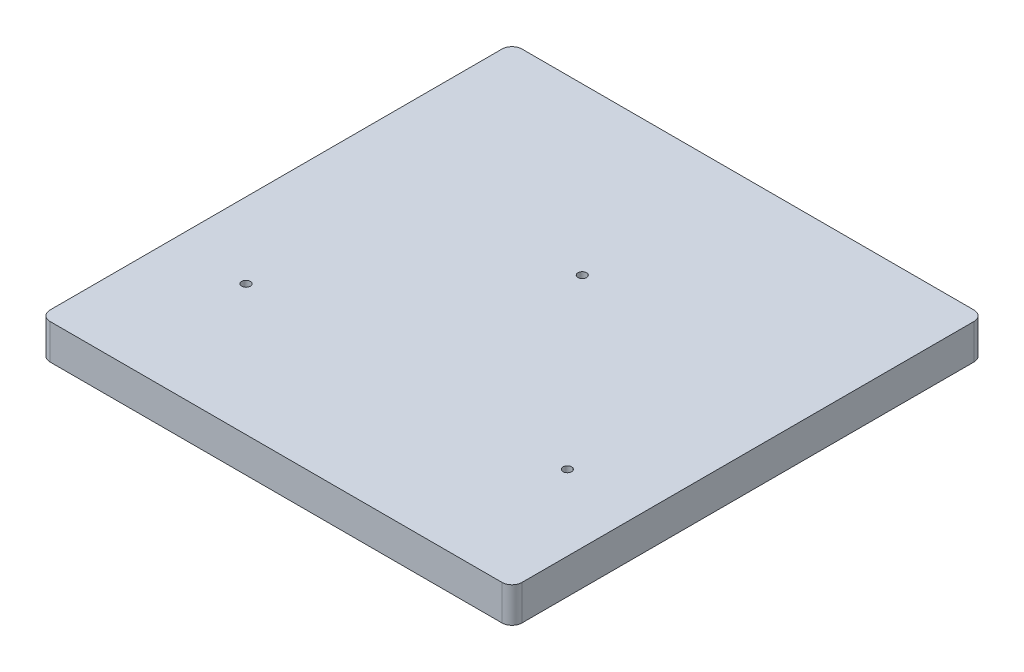
ISO-10303-21;
HEADER;
FILE_DESCRIPTION(('STEP AP214'),'2;1');
FILE_NAME('part.step','',(''),(''),'','','');
FILE_SCHEMA(('AUTOMOTIVE_DESIGN { 1 0 10303 214 1 1 1 1 }'));
ENDSEC;
DATA;
#1=APPLICATION_CONTEXT('core data for automotive mechanical design processes');
#2=APPLICATION_PROTOCOL_DEFINITION('international standard','automotive_design',2000,#1);
#3=PRODUCT_CONTEXT('',#1,'mechanical');
#4=PRODUCT('Part','Part','',(#3));
#5=PRODUCT_RELATED_PRODUCT_CATEGORY('part','',(#4));
#6=PRODUCT_DEFINITION_FORMATION('','',#4);
#7=PRODUCT_DEFINITION_CONTEXT('part definition',#1,'design');
#8=PRODUCT_DEFINITION('design','',#6,#7);
#9=PRODUCT_DEFINITION_SHAPE('','',#8);
#10=(LENGTH_UNIT() NAMED_UNIT(*) SI_UNIT(.MILLI.,.METRE.));
#11=(NAMED_UNIT(*) PLANE_ANGLE_UNIT() SI_UNIT($,.RADIAN.));
#12=(NAMED_UNIT(*) SI_UNIT($,.STERADIAN.) SOLID_ANGLE_UNIT());
#13=UNCERTAINTY_MEASURE_WITH_UNIT(LENGTH_MEASURE(1.E-05),#10,'distance_accuracy_value','');
#14=(GEOMETRIC_REPRESENTATION_CONTEXT(3) GLOBAL_UNCERTAINTY_ASSIGNED_CONTEXT((#13)) GLOBAL_UNIT_ASSIGNED_CONTEXT((#10,
#11,#12)) REPRESENTATION_CONTEXT('',''));
#15=CARTESIAN_POINT('',(0.,0.,0.));
#16=DIRECTION('',(0.,0.,1.));
#17=DIRECTION('',(1.,0.,0.));
#18=AXIS2_PLACEMENT_3D('',#15,#16,#17);
#19=CARTESIAN_POINT('',(76.2,-5.55625,76.2));
#20=DIRECTION('',(0.,1.,0.));
#21=DIRECTION('',(0.,0.,1.));
#22=AXIS2_PLACEMENT_3D('',#19,#20,#21);
#23=PLANE('',#22);
#24=CARTESIAN_POINT('',(-50.8000000000001,-5.55625,33.3077694401946));
#25=DIRECTION('',(0.,1.,0.));
#26=DIRECTION('',(0.,0.,1.));
#27=AXIS2_PLACEMENT_3D('',#24,#25,#26);
#28=CIRCLE('',#27,1.35254999999999);
#29=CARTESIAN_POINT('',(-50.8000000000001,-5.55625,34.6603194401946));
#30=VERTEX_POINT('',#29);
#31=EDGE_CURVE('E12',#30,#30,#28,.T.);
#32=ORIENTED_EDGE('',*,*,#31,.T.);
#33=EDGE_LOOP('',(#32));
#34=FACE_BOUND('',#33,.T.);
#35=CARTESIAN_POINT('',(50.8,-5.55625,33.3077694401947));
#36=DIRECTION('',(0.,1.,0.));
#37=DIRECTION('',(0.,0.,1.));
#38=AXIS2_PLACEMENT_3D('',#35,#36,#37);
#39=CIRCLE('',#38,1.35254999999999);
#40=CARTESIAN_POINT('',(50.8,-5.55625,34.6603194401947));
#41=VERTEX_POINT('',#40);
#42=EDGE_CURVE('E217',#41,#41,#39,.T.);
#43=ORIENTED_EDGE('',*,*,#42,.T.);
#44=EDGE_LOOP('',(#43));
#45=FACE_BOUND('',#44,.T.);
#46=CARTESIAN_POINT('',(0.,-5.55625,-22.2235425877767));
#47=DIRECTION('',(0.,1.,0.));
#48=DIRECTION('',(0.,0.,1.));
#49=AXIS2_PLACEMENT_3D('',#46,#47,#48);
#50=CIRCLE('',#49,1.35255);
#51=CARTESIAN_POINT('',(0.,-5.55625,-20.8709925877767));
#52=VERTEX_POINT('',#51);
#53=EDGE_CURVE('E209',#52,#52,#50,.T.);
#54=ORIENTED_EDGE('',*,*,#53,.T.);
#55=EDGE_LOOP('',(#54));
#56=FACE_BOUND('',#55,.T.);
#57=CARTESIAN_POINT('',(-71.4374999999998,-5.55625,71.4375));
#58=DIRECTION('',(0.,1.,0.));
#59=DIRECTION('',(0.,0.,-1.));
#60=AXIS2_PLACEMENT_3D('',#57,#58,#59);
#61=CIRCLE('',#60,3.175);
#62=CARTESIAN_POINT('',(-74.6124999999998,-5.55625,71.4375));
#63=VERTEX_POINT('',#62);
#64=CARTESIAN_POINT('',(-71.4374999999998,-5.55625,74.6125));
#65=VERTEX_POINT('',#64);
#66=EDGE_CURVE('E66',#63,#65,#61,.T.);
#67=ORIENTED_EDGE('',*,*,#66,.F.);
#68=DIRECTION('',(0.,0.,1.));
#69=VECTOR('',#68,1.);
#70=CARTESIAN_POINT('',(-74.6124999999998,-5.55625,71.4375));
#71=LINE('',#70,#69);
#72=CARTESIAN_POINT('',(-74.6124999999998,-5.55625,-71.4375));
#73=VERTEX_POINT('',#72);
#74=EDGE_CURVE('E154',#73,#63,#71,.T.);
#75=ORIENTED_EDGE('',*,*,#74,.F.);
#76=CARTESIAN_POINT('',(-71.4374999999998,-5.55625,-71.4375));
#77=DIRECTION('',(0.,1.,0.));
#78=DIRECTION('',(0.,0.,-1.));
#79=AXIS2_PLACEMENT_3D('',#76,#77,#78);
#80=CIRCLE('',#79,3.175);
#81=CARTESIAN_POINT('',(-71.4374999999998,-5.55625,-74.6125));
#82=VERTEX_POINT('',#81);
#83=EDGE_CURVE('E150',#82,#73,#80,.T.);
#84=ORIENTED_EDGE('',*,*,#83,.F.);
#85=DIRECTION('',(-1.,0.,0.));
#86=VECTOR('',#85,1.);
#87=CARTESIAN_POINT('',(-71.4374999999998,-5.55625,-74.6125));
#88=LINE('',#87,#86);
#89=CARTESIAN_POINT('',(71.4374999999998,-5.55625,-74.6125));
#90=VERTEX_POINT('',#89);
#91=EDGE_CURVE('E143',#90,#82,#88,.T.);
#92=ORIENTED_EDGE('',*,*,#91,.F.);
#93=CARTESIAN_POINT('',(71.4374999999998,-5.55625,-71.4375));
#94=DIRECTION('',(0.,1.,0.));
#95=DIRECTION('',(0.,0.,-1.));
#96=AXIS2_PLACEMENT_3D('',#93,#94,#95);
#97=CIRCLE('',#96,3.175);
#98=CARTESIAN_POINT('',(74.6124999999998,-5.55625,-71.4375));
#99=VERTEX_POINT('',#98);
#100=EDGE_CURVE('E139',#99,#90,#97,.T.);
#101=ORIENTED_EDGE('',*,*,#100,.F.);
#102=DIRECTION('',(0.,0.,-1.));
#103=VECTOR('',#102,1.);
#104=CARTESIAN_POINT('',(74.6124999999998,-5.55625,71.4375));
#105=LINE('',#104,#103);
#106=CARTESIAN_POINT('',(74.6124999999998,-5.55625,71.4375));
#107=VERTEX_POINT('',#106);
#108=EDGE_CURVE('E120',#107,#99,#105,.T.);
#109=ORIENTED_EDGE('',*,*,#108,.F.);
#110=CARTESIAN_POINT('',(71.4374999999998,-5.55625,71.4375));
#111=DIRECTION('',(0.,1.,0.));
#112=DIRECTION('',(0.,0.,1.));
#113=AXIS2_PLACEMENT_3D('',#110,#111,#112);
#114=CIRCLE('',#113,3.175);
#115=CARTESIAN_POINT('',(71.4374999999998,-5.55625,74.6125));
#116=VERTEX_POINT('',#115);
#117=EDGE_CURVE('E129',#116,#107,#114,.T.);
#118=ORIENTED_EDGE('',*,*,#117,.F.);
#119=DIRECTION('',(1.,0.,0.));
#120=VECTOR('',#119,1.);
#121=CARTESIAN_POINT('',(-71.4374999999998,-5.55625,74.6125));
#122=LINE('',#121,#120);
#123=EDGE_CURVE('E135',#65,#116,#122,.T.);
#124=ORIENTED_EDGE('',*,*,#123,.F.);
#125=EDGE_LOOP('',(#67,#75,#84,#92,#101,#109,#118,#124));
#126=FACE_BOUND('',#125,.T.);
#127=ADVANCED_FACE('F51',(#34,#45,#56,#126),#23,.F.);
#128=CARTESIAN_POINT('',(-76.2,5.55625,76.2));
#129=DIRECTION('',(0.,-1.,0.));
#130=DIRECTION('',(0.,0.,-1.));
#131=AXIS2_PLACEMENT_3D('',#128,#129,#130);
#132=PLANE('',#131);
#133=CARTESIAN_POINT('',(-50.8000000000001,5.55625,33.3077694401946));
#134=DIRECTION('',(0.,1.,0.));
#135=DIRECTION('',(0.,0.,1.));
#136=AXIS2_PLACEMENT_3D('',#133,#134,#135);
#137=CIRCLE('',#136,1.35255);
#138=CARTESIAN_POINT('',(-50.8000000000001,5.55625,34.6603194401946));
#139=VERTEX_POINT('',#138);
#140=EDGE_CURVE('E59',#139,#139,#137,.T.);
#141=ORIENTED_EDGE('',*,*,#140,.F.);
#142=EDGE_LOOP('',(#141));
#143=FACE_BOUND('',#142,.T.);
#144=CARTESIAN_POINT('',(50.8,5.55625,33.3077694401947));
#145=DIRECTION('',(0.,1.,0.));
#146=DIRECTION('',(0.,0.,1.));
#147=AXIS2_PLACEMENT_3D('',#144,#145,#146);
#148=CIRCLE('',#147,1.35255);
#149=CARTESIAN_POINT('',(50.8,5.55625,34.6603194401947));
#150=VERTEX_POINT('',#149);
#151=EDGE_CURVE('E213',#150,#150,#148,.T.);
#152=ORIENTED_EDGE('',*,*,#151,.F.);
#153=EDGE_LOOP('',(#152));
#154=FACE_BOUND('',#153,.T.);
#155=CARTESIAN_POINT('',(0.,5.55625,-22.2235425877767));
#156=DIRECTION('',(0.,1.,0.));
#157=DIRECTION('',(0.,0.,1.));
#158=AXIS2_PLACEMENT_3D('',#155,#156,#157);
#159=CIRCLE('',#158,1.35255);
#160=CARTESIAN_POINT('',(0.,5.55625,-20.8709925877767));
#161=VERTEX_POINT('',#160);
#162=EDGE_CURVE('E190',#161,#161,#159,.T.);
#163=ORIENTED_EDGE('',*,*,#162,.F.);
#164=EDGE_LOOP('',(#163));
#165=FACE_BOUND('',#164,.T.);
#166=CARTESIAN_POINT('',(-71.4374999999998,5.55625,71.4375));
#167=DIRECTION('',(0.,1.,0.));
#168=DIRECTION('',(0.,0.,-1.));
#169=AXIS2_PLACEMENT_3D('',#166,#167,#168);
#170=CIRCLE('',#169,3.175);
#171=CARTESIAN_POINT('',(-74.6124999999998,5.55625,71.4375));
#172=VERTEX_POINT('',#171);
#173=CARTESIAN_POINT('',(-71.4374999999998,5.55625,74.6125));
#174=VERTEX_POINT('',#173);
#175=EDGE_CURVE('E159',#172,#174,#170,.T.);
#176=ORIENTED_EDGE('',*,*,#175,.T.);
#177=DIRECTION('',(1.,0.,0.));
#178=VECTOR('',#177,1.);
#179=CARTESIAN_POINT('',(-71.4374999999998,5.55625,74.6125));
#180=LINE('',#179,#178);
#181=CARTESIAN_POINT('',(71.4374999999998,5.55625,74.6125));
#182=VERTEX_POINT('',#181);
#183=EDGE_CURVE('E163',#174,#182,#180,.T.);
#184=ORIENTED_EDGE('',*,*,#183,.T.);
#185=CARTESIAN_POINT('',(71.4374999999998,5.55625,71.4375));
#186=DIRECTION('',(0.,1.,0.));
#187=DIRECTION('',(0.,0.,1.));
#188=AXIS2_PLACEMENT_3D('',#185,#186,#187);
#189=CIRCLE('',#188,3.175);
#190=CARTESIAN_POINT('',(74.6124999999998,5.55625,71.4375));
#191=VERTEX_POINT('',#190);
#192=EDGE_CURVE('E74',#182,#191,#189,.T.);
#193=ORIENTED_EDGE('',*,*,#192,.T.);
#194=DIRECTION('',(0.,0.,-1.));
#195=VECTOR('',#194,1.);
#196=CARTESIAN_POINT('',(74.6124999999998,5.55625,71.4375));
#197=LINE('',#196,#195);
#198=CARTESIAN_POINT('',(74.6124999999998,5.55625,-71.4375));
#199=VERTEX_POINT('',#198);
#200=EDGE_CURVE('E123',#191,#199,#197,.T.);
#201=ORIENTED_EDGE('',*,*,#200,.T.);
#202=CARTESIAN_POINT('',(71.4374999999998,5.55625,-71.4375));
#203=DIRECTION('',(0.,1.,0.));
#204=DIRECTION('',(0.,0.,-1.));
#205=AXIS2_PLACEMENT_3D('',#202,#203,#204);
#206=CIRCLE('',#205,3.175);
#207=CARTESIAN_POINT('',(71.4374999999998,5.55625,-74.6125));
#208=VERTEX_POINT('',#207);
#209=EDGE_CURVE('E171',#199,#208,#206,.T.);
#210=ORIENTED_EDGE('',*,*,#209,.T.);
#211=DIRECTION('',(-1.,0.,0.));
#212=VECTOR('',#211,1.);
#213=CARTESIAN_POINT('',(-71.4374999999998,5.55625,-74.6125));
#214=LINE('',#213,#212);
#215=CARTESIAN_POINT('',(-71.4374999999998,5.55625,-74.6125));
#216=VERTEX_POINT('',#215);
#217=EDGE_CURVE('E175',#208,#216,#214,.T.);
#218=ORIENTED_EDGE('',*,*,#217,.T.);
#219=CARTESIAN_POINT('',(-71.4374999999998,5.55625,-71.4375));
#220=DIRECTION('',(0.,1.,0.));
#221=DIRECTION('',(0.,0.,-1.));
#222=AXIS2_PLACEMENT_3D('',#219,#220,#221);
#223=CIRCLE('',#222,3.175);
#224=CARTESIAN_POINT('',(-74.6124999999998,5.55625,-71.4375));
#225=VERTEX_POINT('',#224);
#226=EDGE_CURVE('E179',#216,#225,#223,.T.);
#227=ORIENTED_EDGE('',*,*,#226,.T.);
#228=DIRECTION('',(0.,0.,1.));
#229=VECTOR('',#228,1.);
#230=CARTESIAN_POINT('',(-74.6124999999998,5.55625,71.4375));
#231=LINE('',#230,#229);
#232=EDGE_CURVE('E183',#225,#172,#231,.T.);
#233=ORIENTED_EDGE('',*,*,#232,.T.);
#234=EDGE_LOOP('',(#176,#184,#193,#201,#210,#218,#227,#233));
#235=FACE_BOUND('',#234,.T.);
#236=ADVANCED_FACE('F226',(#143,#154,#165,#235),#132,.F.);
#237=CARTESIAN_POINT('',(-50.8000000000001,5.55625,33.3077694401946));
#238=DIRECTION('',(0.,1.,0.));
#239=DIRECTION('',(0.,0.,1.));
#240=AXIS2_PLACEMENT_3D('',#237,#238,#239);
#241=CYLINDRICAL_SURFACE('',#240,1.35255);
#242=ORIENTED_EDGE('',*,*,#31,.F.);
#243=EDGE_LOOP('',(#242));
#244=FACE_BOUND('',#243,.T.);
#245=ORIENTED_EDGE('',*,*,#140,.T.);
#246=EDGE_LOOP('',(#245));
#247=FACE_BOUND('',#246,.T.);
#248=ADVANCED_FACE('F224',(#244,#247),#241,.F.);
#249=CARTESIAN_POINT('',(50.8,5.55625,33.3077694401947));
#250=DIRECTION('',(0.,1.,0.));
#251=DIRECTION('',(0.,0.,1.));
#252=AXIS2_PLACEMENT_3D('',#249,#250,#251);
#253=CYLINDRICAL_SURFACE('',#252,1.35255);
#254=ORIENTED_EDGE('',*,*,#42,.F.);
#255=EDGE_LOOP('',(#254));
#256=FACE_BOUND('',#255,.T.);
#257=ORIENTED_EDGE('',*,*,#151,.T.);
#258=EDGE_LOOP('',(#257));
#259=FACE_BOUND('',#258,.T.);
#260=ADVANCED_FACE('F276',(#256,#259),#253,.F.);
#261=CARTESIAN_POINT('',(0.,5.55625,-22.2235425877767));
#262=DIRECTION('',(0.,1.,0.));
#263=DIRECTION('',(0.,0.,1.));
#264=AXIS2_PLACEMENT_3D('',#261,#262,#263);
#265=CYLINDRICAL_SURFACE('',#264,1.35255);
#266=ORIENTED_EDGE('',*,*,#53,.F.);
#267=EDGE_LOOP('',(#266));
#268=FACE_BOUND('',#267,.T.);
#269=ORIENTED_EDGE('',*,*,#162,.T.);
#270=EDGE_LOOP('',(#269));
#271=FACE_BOUND('',#270,.T.);
#272=ADVANCED_FACE('F273',(#268,#271),#265,.F.);
#273=CARTESIAN_POINT('',(-71.4374999999998,-5.55625,71.4375));
#274=DIRECTION('',(0.,1.,0.));
#275=DIRECTION('',(0.,0.,1.));
#276=AXIS2_PLACEMENT_3D('',#273,#274,#275);
#277=CYLINDRICAL_SURFACE('',#276,3.175);
#278=ORIENTED_EDGE('',*,*,#175,.F.);
#279=DIRECTION('',(0.,1.,0.));
#280=VECTOR('',#279,1.);
#281=CARTESIAN_POINT('',(-74.6124999999998,-5.55625,71.4375));
#282=LINE('',#281,#280);
#283=EDGE_CURVE('E187',#63,#172,#282,.T.);
#284=ORIENTED_EDGE('',*,*,#283,.F.);
#285=ORIENTED_EDGE('',*,*,#66,.T.);
#286=DIRECTION('',(0.,1.,0.));
#287=VECTOR('',#286,1.);
#288=CARTESIAN_POINT('',(-71.4374999999998,-5.55625,74.6125));
#289=LINE('',#288,#287);
#290=EDGE_CURVE('E158',#65,#174,#289,.T.);
#291=ORIENTED_EDGE('',*,*,#290,.T.);
#292=EDGE_LOOP('',(#278,#284,#285,#291));
#293=FACE_BOUND('',#292,.T.);
#294=ADVANCED_FACE('F236',(#293),#277,.T.);
#295=CARTESIAN_POINT('',(-74.6124999999998,-5.55625,71.4375));
#296=DIRECTION('',(-1.,0.,0.));
#297=DIRECTION('',(0.,0.,1.));
#298=AXIS2_PLACEMENT_3D('',#295,#296,#297);
#299=PLANE('',#298);
#300=ORIENTED_EDGE('',*,*,#232,.F.);
#301=DIRECTION('',(0.,1.,0.));
#302=VECTOR('',#301,1.);
#303=CARTESIAN_POINT('',(-74.6124999999998,-5.55625,-71.4375));
#304=LINE('',#303,#302);
#305=EDGE_CURVE('E191',#73,#225,#304,.T.);
#306=ORIENTED_EDGE('',*,*,#305,.F.);
#307=ORIENTED_EDGE('',*,*,#74,.T.);
#308=ORIENTED_EDGE('',*,*,#283,.T.);
#309=EDGE_LOOP('',(#300,#306,#307,#308));
#310=FACE_BOUND('',#309,.T.);
#311=ADVANCED_FACE('F245',(#310),#299,.T.);
#312=CARTESIAN_POINT('',(-71.4374999999998,-5.55625,-71.4375));
#313=DIRECTION('',(0.,1.,0.));
#314=DIRECTION('',(0.,0.,1.));
#315=AXIS2_PLACEMENT_3D('',#312,#313,#314);
#316=CYLINDRICAL_SURFACE('',#315,3.175);
#317=ORIENTED_EDGE('',*,*,#226,.F.);
#318=DIRECTION('',(0.,1.,0.));
#319=VECTOR('',#318,1.);
#320=CARTESIAN_POINT('',(-71.4374999999998,-5.55625,-74.6125));
#321=LINE('',#320,#319);
#322=EDGE_CURVE('E194',#82,#216,#321,.T.);
#323=ORIENTED_EDGE('',*,*,#322,.F.);
#324=ORIENTED_EDGE('',*,*,#83,.T.);
#325=ORIENTED_EDGE('',*,*,#305,.T.);
#326=EDGE_LOOP('',(#317,#323,#324,#325));
#327=FACE_BOUND('',#326,.T.);
#328=ADVANCED_FACE('F248',(#327),#316,.T.);
#329=CARTESIAN_POINT('',(-71.4374999999998,-5.55625,-74.6125));
#330=DIRECTION('',(0.,0.,-1.));
#331=DIRECTION('',(-1.,0.,0.));
#332=AXIS2_PLACEMENT_3D('',#329,#330,#331);
#333=PLANE('',#332);
#334=ORIENTED_EDGE('',*,*,#217,.F.);
#335=DIRECTION('',(0.,1.,0.));
#336=VECTOR('',#335,1.);
#337=CARTESIAN_POINT('',(71.4374999999998,-5.55625,-74.6125));
#338=LINE('',#337,#336);
#339=EDGE_CURVE('E197',#90,#208,#338,.T.);
#340=ORIENTED_EDGE('',*,*,#339,.F.);
#341=ORIENTED_EDGE('',*,*,#91,.T.);
#342=ORIENTED_EDGE('',*,*,#322,.T.);
#343=EDGE_LOOP('',(#334,#340,#341,#342));
#344=FACE_BOUND('',#343,.T.);
#345=ADVANCED_FACE('F251',(#344),#333,.T.);
#346=CARTESIAN_POINT('',(71.4374999999998,-5.55625,-71.4375));
#347=DIRECTION('',(0.,1.,0.));
#348=DIRECTION('',(0.,0.,1.));
#349=AXIS2_PLACEMENT_3D('',#346,#347,#348);
#350=CYLINDRICAL_SURFACE('',#349,3.175);
#351=ORIENTED_EDGE('',*,*,#209,.F.);
#352=DIRECTION('',(0.,1.,0.));
#353=VECTOR('',#352,1.);
#354=CARTESIAN_POINT('',(74.6124999999998,-5.55625,-71.4375));
#355=LINE('',#354,#353);
#356=EDGE_CURVE('E125',#99,#199,#355,.T.);
#357=ORIENTED_EDGE('',*,*,#356,.F.);
#358=ORIENTED_EDGE('',*,*,#100,.T.);
#359=ORIENTED_EDGE('',*,*,#339,.T.);
#360=EDGE_LOOP('',(#351,#357,#358,#359));
#361=FACE_BOUND('',#360,.T.);
#362=ADVANCED_FACE('F254',(#361),#350,.T.);
#363=CARTESIAN_POINT('',(74.6124999999998,-5.55625,71.4375));
#364=DIRECTION('',(1.,0.,0.));
#365=DIRECTION('',(0.,0.,-1.));
#366=AXIS2_PLACEMENT_3D('',#363,#364,#365);
#367=PLANE('',#366);
#368=ORIENTED_EDGE('',*,*,#200,.F.);
#369=DIRECTION('',(0.,1.,0.));
#370=VECTOR('',#369,1.);
#371=CARTESIAN_POINT('',(74.6124999999998,-5.55625,71.4375));
#372=LINE('',#371,#370);
#373=EDGE_CURVE('E116',#107,#191,#372,.T.);
#374=ORIENTED_EDGE('',*,*,#373,.F.);
#375=ORIENTED_EDGE('',*,*,#108,.T.);
#376=ORIENTED_EDGE('',*,*,#356,.T.);
#377=EDGE_LOOP('',(#368,#374,#375,#376));
#378=FACE_BOUND('',#377,.T.);
#379=ADVANCED_FACE('F118',(#378),#367,.T.);
#380=CARTESIAN_POINT('',(71.4374999999998,-5.55625,71.4375));
#381=DIRECTION('',(0.,1.,0.));
#382=DIRECTION('',(0.,0.,1.));
#383=AXIS2_PLACEMENT_3D('',#380,#381,#382);
#384=CYLINDRICAL_SURFACE('',#383,3.175);
#385=ORIENTED_EDGE('',*,*,#192,.F.);
#386=DIRECTION('',(0.,1.,0.));
#387=VECTOR('',#386,1.);
#388=CARTESIAN_POINT('',(71.4374999999998,-5.55625,74.6125));
#389=LINE('',#388,#387);
#390=EDGE_CURVE('E126',#116,#182,#389,.T.);
#391=ORIENTED_EDGE('',*,*,#390,.F.);
#392=ORIENTED_EDGE('',*,*,#117,.T.);
#393=ORIENTED_EDGE('',*,*,#373,.T.);
#394=EDGE_LOOP('',(#385,#391,#392,#393));
#395=FACE_BOUND('',#394,.T.);
#396=ADVANCED_FACE('F130',(#395),#384,.T.);
#397=CARTESIAN_POINT('',(-71.4374999999998,-5.55625,74.6125));
#398=DIRECTION('',(0.,0.,1.));
#399=DIRECTION('',(1.,0.,0.));
#400=AXIS2_PLACEMENT_3D('',#397,#398,#399);
#401=PLANE('',#400);
#402=ORIENTED_EDGE('',*,*,#183,.F.);
#403=ORIENTED_EDGE('',*,*,#290,.F.);
#404=ORIENTED_EDGE('',*,*,#123,.T.);
#405=ORIENTED_EDGE('',*,*,#390,.T.);
#406=EDGE_LOOP('',(#402,#403,#404,#405));
#407=FACE_BOUND('',#406,.T.);
#408=ADVANCED_FACE('F238',(#407),#401,.T.);
#409=CLOSED_SHELL('',(#127,#236,#248,#260,#272,#294,#311,#328,#345,#362,#379,#396,#408));
#410=MANIFOLD_SOLID_BREP('B2',#409);
#411=ADVANCED_BREP_SHAPE_REPRESENTATION('',(#18,#410),#14);
#412=SHAPE_DEFINITION_REPRESENTATION(#9,#411);
ENDSEC;
END-ISO-10303-21;
